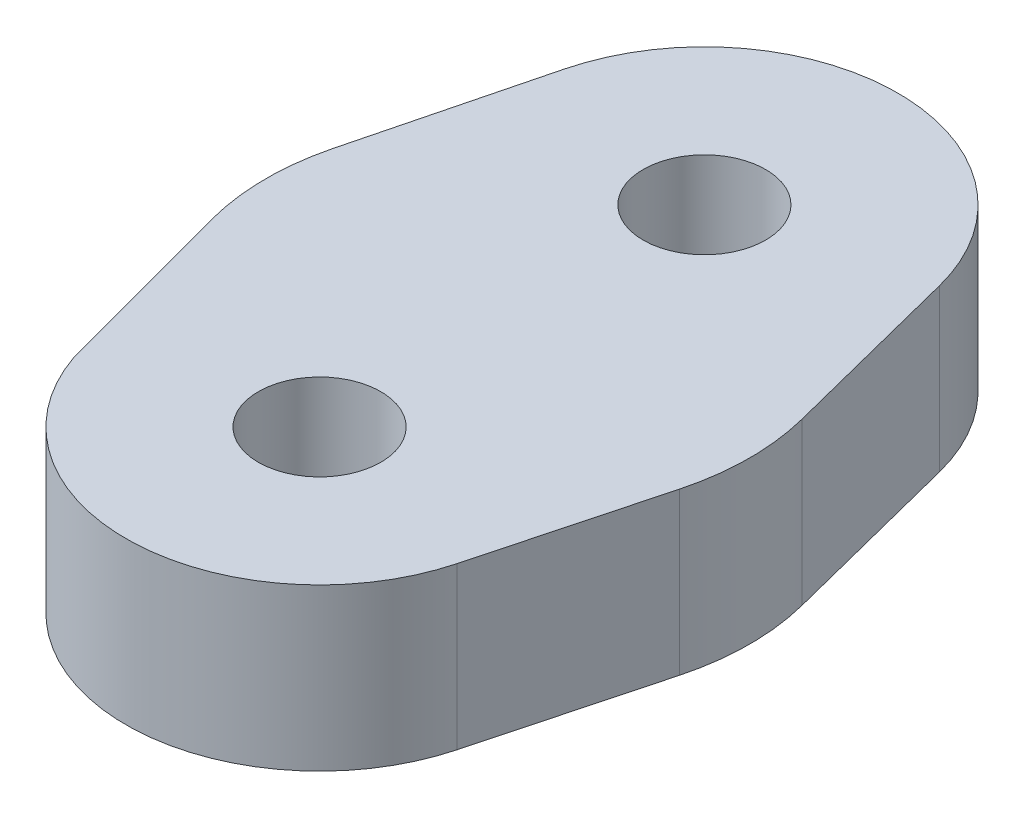
ISO-10303-21;
HEADER;
FILE_DESCRIPTION(('STEP AP214'),'2;1');
FILE_NAME('part.step','',(''),(''),'','','');
FILE_SCHEMA(('AUTOMOTIVE_DESIGN { 1 0 10303 214 1 1 1 1 }'));
ENDSEC;
DATA;
#1=APPLICATION_CONTEXT('core data for automotive mechanical design processes');
#2=APPLICATION_PROTOCOL_DEFINITION('international standard','automotive_design',2000,#1);
#3=PRODUCT_CONTEXT('',#1,'mechanical');
#4=PRODUCT('Part','Part','',(#3));
#5=PRODUCT_RELATED_PRODUCT_CATEGORY('part','',(#4));
#6=PRODUCT_DEFINITION_FORMATION('','',#4);
#7=PRODUCT_DEFINITION_CONTEXT('part definition',#1,'design');
#8=PRODUCT_DEFINITION('design','',#6,#7);
#9=PRODUCT_DEFINITION_SHAPE('','',#8);
#10=(LENGTH_UNIT() NAMED_UNIT(*) SI_UNIT(.MILLI.,.METRE.));
#11=(NAMED_UNIT(*) PLANE_ANGLE_UNIT() SI_UNIT($,.RADIAN.));
#12=(NAMED_UNIT(*) SI_UNIT($,.STERADIAN.) SOLID_ANGLE_UNIT());
#13=UNCERTAINTY_MEASURE_WITH_UNIT(LENGTH_MEASURE(1.E-05),#10,'distance_accuracy_value','');
#14=(GEOMETRIC_REPRESENTATION_CONTEXT(3) GLOBAL_UNCERTAINTY_ASSIGNED_CONTEXT((#13)) GLOBAL_UNIT_ASSIGNED_CONTEXT((#10,
#11,#12)) REPRESENTATION_CONTEXT('',''));
#15=CARTESIAN_POINT('',(0.,0.,0.));
#16=DIRECTION('',(0.,0.,1.));
#17=DIRECTION('',(1.,0.,0.));
#18=AXIS2_PLACEMENT_3D('',#15,#16,#17);
#19=CARTESIAN_POINT('',(10.7914021707681,5.,-2.7425994459952));
#20=DIRECTION('',(-0.969189489495146,0.,0.246316328025849));
#21=DIRECTION('',(0.246316328025849,0.,0.969189489495146));
#22=AXIS2_PLACEMENT_3D('',#19,#20,#21);
#23=PLANE('',#22);
#24=DIRECTION('',(-0.246316328025849,0.,-0.969189489495146));
#25=VECTOR('',#24,1.);
#26=CARTESIAN_POINT('',(10.7914021707681,0.,-2.7425994459952));
#27=LINE('',#26,#25);
#28=CARTESIAN_POINT('',(11.0189211712136,0.,-1.84737246019386));
#29=VERTEX_POINT('',#28);
#30=CARTESIAN_POINT('',(9.56513693697088,0.,-7.56762824313138));
#31=VERTEX_POINT('',#30);
#32=EDGE_CURVE('E129',#29,#31,#27,.T.);
#33=ORIENTED_EDGE('',*,*,#32,.T.);
#34=DIRECTION('',(0.,-1.,0.));
#35=VECTOR('',#34,1.);
#36=CARTESIAN_POINT('',(9.56513693697088,5.,-7.56762824313138));
#37=LINE('',#36,#35);
#38=CARTESIAN_POINT('',(9.56513693697088,5.,-7.56762824313138));
#39=VERTEX_POINT('',#38);
#40=EDGE_CURVE('E11',#39,#31,#37,.T.);
#41=ORIENTED_EDGE('',*,*,#40,.F.);
#42=DIRECTION('',(-0.246316328025849,0.,-0.969189489495146));
#43=VECTOR('',#42,1.);
#44=CARTESIAN_POINT('',(10.7914021707681,5.,-2.7425994459952));
#45=LINE('',#44,#43);
#46=CARTESIAN_POINT('',(11.0189211712136,5.,-1.84737246019386));
#47=VERTEX_POINT('',#46);
#48=EDGE_CURVE('E145',#47,#39,#45,.T.);
#49=ORIENTED_EDGE('',*,*,#48,.F.);
#50=DIRECTION('',(0.,-1.,0.));
#51=VECTOR('',#50,1.);
#52=CARTESIAN_POINT('',(11.0189211712136,5.,-1.84737246019386));
#53=LINE('',#52,#51);
#54=EDGE_CURVE('E125',#47,#29,#53,.T.);
#55=ORIENTED_EDGE('',*,*,#54,.T.);
#56=EDGE_LOOP('',(#33,#41,#49,#55));
#57=FACE_BOUND('',#56,.T.);
#58=ADVANCED_FACE('F34',(#57),#23,.F.);
#59=CARTESIAN_POINT('',(3.75,5.,-6.08973027497629));
#60=DIRECTION('',(0.,-1.,0.));
#61=DIRECTION('',(0.,0.,-1.));
#62=AXIS2_PLACEMENT_3D('',#59,#60,#61);
#63=CYLINDRICAL_SURFACE('',#62,6.);
#64=CARTESIAN_POINT('',(3.75,0.,-6.08973027497629));
#65=DIRECTION('',(0.,1.,0.));
#66=DIRECTION('',(0.,0.,1.));
#67=AXIS2_PLACEMENT_3D('',#64,#65,#66);
#68=CIRCLE('',#67,6.);
#69=CARTESIAN_POINT('',(-2.06513693697088,0.,-7.56762824313138));
#70=VERTEX_POINT('',#69);
#71=EDGE_CURVE('E132',#31,#70,#68,.T.);
#72=ORIENTED_EDGE('',*,*,#71,.T.);
#73=DIRECTION('',(0.,-1.,0.));
#74=VECTOR('',#73,1.);
#75=CARTESIAN_POINT('',(-2.06513693697088,5.,-7.56762824313138));
#76=LINE('',#75,#74);
#77=CARTESIAN_POINT('',(-2.06513693697088,5.,-7.56762824313138));
#78=VERTEX_POINT('',#77);
#79=EDGE_CURVE('E42',#78,#70,#76,.T.);
#80=ORIENTED_EDGE('',*,*,#79,.F.);
#81=CARTESIAN_POINT('',(3.75,5.,-6.08973027497629));
#82=DIRECTION('',(0.,1.,0.));
#83=DIRECTION('',(0.,0.,1.));
#84=AXIS2_PLACEMENT_3D('',#81,#82,#83);
#85=CIRCLE('',#84,6.);
#86=EDGE_CURVE('E89',#39,#78,#85,.T.);
#87=ORIENTED_EDGE('',*,*,#86,.F.);
#88=ORIENTED_EDGE('',*,*,#40,.T.);
#89=EDGE_LOOP('',(#72,#80,#87,#88));
#90=FACE_BOUND('',#89,.T.);
#91=ADVANCED_FACE('F212',(#90),#63,.T.);
#92=CARTESIAN_POINT('',(-3.74644017165911,5.,-0.95214547439252));
#93=DIRECTION('',(0.969189489495147,0.,0.246316328025848));
#94=DIRECTION('',(0.246316328025848,0.,-0.969189489495147));
#95=AXIS2_PLACEMENT_3D('',#92,#93,#94);
#96=PLANE('',#95);
#97=DIRECTION('',(-0.246316328025848,0.,0.969189489495147));
#98=VECTOR('',#97,1.);
#99=CARTESIAN_POINT('',(-3.74644017165911,0.,-0.95214547439252));
#100=LINE('',#99,#98);
#101=CARTESIAN_POINT('',(-3.5189211712136,0.,-1.84737246019386));
#102=VERTEX_POINT('',#101);
#103=EDGE_CURVE('E135',#70,#102,#100,.T.);
#104=ORIENTED_EDGE('',*,*,#103,.T.);
#105=DIRECTION('',(0.,-1.,0.));
#106=VECTOR('',#105,1.);
#107=CARTESIAN_POINT('',(-3.5189211712136,5.,-1.84737246019386));
#108=LINE('',#107,#106);
#109=CARTESIAN_POINT('',(-3.5189211712136,5.,-1.84737246019386));
#110=VERTEX_POINT('',#109);
#111=EDGE_CURVE('E152',#110,#102,#108,.T.);
#112=ORIENTED_EDGE('',*,*,#111,.F.);
#113=DIRECTION('',(-0.246316328025848,0.,0.969189489495147));
#114=VECTOR('',#113,1.);
#115=CARTESIAN_POINT('',(-3.74644017165911,5.,-0.95214547439252));
#116=LINE('',#115,#114);
#117=EDGE_CURVE('E160',#78,#110,#116,.T.);
#118=ORIENTED_EDGE('',*,*,#117,.F.);
#119=ORIENTED_EDGE('',*,*,#79,.T.);
#120=EDGE_LOOP('',(#104,#112,#118,#119));
#121=FACE_BOUND('',#120,.T.);
#122=ADVANCED_FACE('F158',(#121),#96,.F.);
#123=CARTESIAN_POINT('',(3.75,5.,0.));
#124=DIRECTION('',(0.,-1.,0.));
#125=DIRECTION('',(0.,0.,-1.));
#126=AXIS2_PLACEMENT_3D('',#123,#124,#125);
#127=CYLINDRICAL_SURFACE('',#126,7.5);
#128=CARTESIAN_POINT('',(3.75,0.,0.));
#129=DIRECTION('',(0.,1.,0.));
#130=DIRECTION('',(0.,0.,1.));
#131=AXIS2_PLACEMENT_3D('',#128,#129,#130);
#132=CIRCLE('',#131,7.5);
#133=CARTESIAN_POINT('',(-3.49342660554137,0.,1.94493470587972));
#134=VERTEX_POINT('',#133);
#135=EDGE_CURVE('E137',#102,#134,#132,.T.);
#136=ORIENTED_EDGE('',*,*,#135,.T.);
#137=DIRECTION('',(0.,-1.,0.));
#138=VECTOR('',#137,1.);
#139=CARTESIAN_POINT('',(-3.49342660554137,5.,1.94493470587972));
#140=LINE('',#139,#138);
#141=CARTESIAN_POINT('',(-3.49342660554137,5.,1.94493470587972));
#142=VERTEX_POINT('',#141);
#143=EDGE_CURVE('E149',#142,#134,#140,.T.);
#144=ORIENTED_EDGE('',*,*,#143,.F.);
#145=CARTESIAN_POINT('',(3.75,5.,0.));
#146=DIRECTION('',(0.,1.,0.));
#147=DIRECTION('',(0.,0.,1.));
#148=AXIS2_PLACEMENT_3D('',#145,#146,#147);
#149=CIRCLE('',#148,7.5);
#150=EDGE_CURVE('E172',#110,#142,#149,.T.);
#151=ORIENTED_EDGE('',*,*,#150,.F.);
#152=ORIENTED_EDGE('',*,*,#111,.T.);
#153=EDGE_LOOP('',(#136,#144,#151,#152));
#154=FACE_BOUND('',#153,.T.);
#155=ADVANCED_FACE('F168',(#154),#127,.T.);
#156=CARTESIAN_POINT('',(-3.7456113395504,5.,1.00573525290572));
#157=DIRECTION('',(0.965790214072183,0.,-0.259324627450629));
#158=DIRECTION('',(-0.259324627450629,0.,-0.965790214072183));
#159=AXIS2_PLACEMENT_3D('',#156,#157,#158);
#160=PLANE('',#159);
#161=DIRECTION('',(0.259324627450629,0.,0.965790214072183));
#162=VECTOR('',#161,1.);
#163=CARTESIAN_POINT('',(-3.7456113395504,0.,1.00573525290572));
#164=LINE('',#163,#162);
#165=CARTESIAN_POINT('',(-1.92167348288411,0.,7.79853912333431));
#166=VERTEX_POINT('',#165);
#167=EDGE_CURVE('E139',#134,#166,#164,.T.);
#168=ORIENTED_EDGE('',*,*,#167,.T.);
#169=DIRECTION('',(0.,-1.,0.));
#170=VECTOR('',#169,1.);
#171=CARTESIAN_POINT('',(-1.92167348288411,5.,7.79853912333431));
#172=LINE('',#171,#170);
#173=CARTESIAN_POINT('',(-1.92167348288411,5.,7.79853912333431));
#174=VERTEX_POINT('',#173);
#175=EDGE_CURVE('E121',#174,#166,#172,.T.);
#176=ORIENTED_EDGE('',*,*,#175,.F.);
#177=DIRECTION('',(0.259324627450629,0.,0.965790214072183));
#178=VECTOR('',#177,1.);
#179=CARTESIAN_POINT('',(-3.7456113395504,5.,1.00573525290572));
#180=LINE('',#179,#178);
#181=EDGE_CURVE('E108',#142,#174,#180,.T.);
#182=ORIENTED_EDGE('',*,*,#181,.F.);
#183=ORIENTED_EDGE('',*,*,#143,.T.);
#184=EDGE_LOOP('',(#168,#176,#182,#183));
#185=FACE_BOUND('',#184,.T.);
#186=ADVANCED_FACE('F171',(#185),#160,.F.);
#187=CARTESIAN_POINT('',(3.75,5.,5.84095900912463));
#188=DIRECTION('',(0.,-1.,0.));
#189=DIRECTION('',(0.,0.,-1.));
#190=AXIS2_PLACEMENT_3D('',#187,#188,#189);
#191=CYLINDRICAL_SURFACE('',#190,6.);
#192=CARTESIAN_POINT('',(3.75,0.,5.84095900912463));
#193=DIRECTION('',(0.,1.,0.));
#194=DIRECTION('',(0.,0.,1.));
#195=AXIS2_PLACEMENT_3D('',#192,#193,#194);
#196=CIRCLE('',#195,6.);
#197=CARTESIAN_POINT('',(9.54877601505246,0.,7.38180187173338));
#198=VERTEX_POINT('',#197);
#199=EDGE_CURVE('E117',#166,#198,#196,.T.);
#200=ORIENTED_EDGE('',*,*,#199,.T.);
#201=DIRECTION('',(0.,-1.,0.));
#202=VECTOR('',#201,1.);
#203=CARTESIAN_POINT('',(9.54877601505246,5.,7.38180187173338));
#204=LINE('',#203,#202);
#205=CARTESIAN_POINT('',(9.54877601505246,5.,7.38180187173338));
#206=VERTEX_POINT('',#205);
#207=EDGE_CURVE('E114',#206,#198,#204,.T.);
#208=ORIENTED_EDGE('',*,*,#207,.F.);
#209=CARTESIAN_POINT('',(3.75,5.,5.84095900912463));
#210=DIRECTION('',(0.,1.,0.));
#211=DIRECTION('',(0.,0.,1.));
#212=AXIS2_PLACEMENT_3D('',#209,#210,#211);
#213=CIRCLE('',#212,6.);
#214=EDGE_CURVE('E102',#174,#206,#213,.T.);
#215=ORIENTED_EDGE('',*,*,#214,.F.);
#216=ORIENTED_EDGE('',*,*,#175,.T.);
#217=EDGE_LOOP('',(#200,#208,#215,#216));
#218=FACE_BOUND('',#217,.T.);
#219=ADVANCED_FACE('F115',(#218),#191,.T.);
#220=CARTESIAN_POINT('',(10.7511578597268,5.,2.8567830193714));
#221=DIRECTION('',(0.96646266917541,0.,0.256807143768126));
#222=DIRECTION('',(0.256807143768126,0.,-0.96646266917541));
#223=AXIS2_PLACEMENT_3D('',#220,#221,#222);
#224=PLANE('',#223);
#225=DIRECTION('',(-0.256807143768126,0.,0.96646266917541));
#226=VECTOR('',#225,1.);
#227=CARTESIAN_POINT('',(10.7511578597268,0.,2.8567830193714));
#228=LINE('',#227,#226);
#229=CARTESIAN_POINT('',(10.9984700188156,0.,1.92605357826094));
#230=VERTEX_POINT('',#229);
#231=EDGE_CURVE('E142',#230,#198,#228,.T.);
#232=ORIENTED_EDGE('',*,*,#231,.F.);
#233=DIRECTION('',(0.,-1.,0.));
#234=VECTOR('',#233,1.);
#235=CARTESIAN_POINT('',(10.9984700188156,5.,1.92605357826094));
#236=LINE('',#235,#234);
#237=CARTESIAN_POINT('',(10.9984700188156,5.,1.92605357826094));
#238=VERTEX_POINT('',#237);
#239=EDGE_CURVE('E78',#238,#230,#236,.T.);
#240=ORIENTED_EDGE('',*,*,#239,.F.);
#241=DIRECTION('',(-0.256807143768126,0.,0.96646266917541));
#242=VECTOR('',#241,1.);
#243=CARTESIAN_POINT('',(10.7511578597268,5.,2.8567830193714));
#244=LINE('',#243,#242);
#245=EDGE_CURVE('E106',#238,#206,#244,.T.);
#246=ORIENTED_EDGE('',*,*,#245,.T.);
#247=ORIENTED_EDGE('',*,*,#207,.T.);
#248=EDGE_LOOP('',(#232,#240,#246,#247));
#249=FACE_BOUND('',#248,.T.);
#250=ADVANCED_FACE('F123',(#249),#224,.T.);
#251=CARTESIAN_POINT('',(3.75,5.,0.));
#252=DIRECTION('',(0.,-1.,0.));
#253=DIRECTION('',(0.,0.,-1.));
#254=AXIS2_PLACEMENT_3D('',#251,#252,#253);
#255=CYLINDRICAL_SURFACE('',#254,7.5);
#256=CARTESIAN_POINT('',(3.75,0.,0.));
#257=DIRECTION('',(0.,1.,0.));
#258=DIRECTION('',(0.,0.,1.));
#259=AXIS2_PLACEMENT_3D('',#256,#257,#258);
#260=CIRCLE('',#259,7.5);
#261=EDGE_CURVE('E81',#230,#29,#260,.T.);
#262=ORIENTED_EDGE('',*,*,#261,.T.);
#263=ORIENTED_EDGE('',*,*,#54,.F.);
#264=CARTESIAN_POINT('',(3.75,5.,0.));
#265=DIRECTION('',(0.,1.,0.));
#266=DIRECTION('',(0.,0.,1.));
#267=AXIS2_PLACEMENT_3D('',#264,#265,#266);
#268=CIRCLE('',#267,7.5);
#269=EDGE_CURVE('E50',#238,#47,#268,.T.);
#270=ORIENTED_EDGE('',*,*,#269,.F.);
#271=ORIENTED_EDGE('',*,*,#239,.T.);
#272=EDGE_LOOP('',(#262,#263,#270,#271));
#273=FACE_BOUND('',#272,.T.);
#274=ADVANCED_FACE('F194',(#273),#255,.T.);
#275=CARTESIAN_POINT('',(0.,5.,0.));
#276=DIRECTION('',(0.,1.,0.));
#277=DIRECTION('',(0.,0.,1.));
#278=AXIS2_PLACEMENT_3D('',#275,#276,#277);
#279=PLANE('',#278);
#280=CARTESIAN_POINT('',(3.75,5.,-6.08973027497629));
#281=DIRECTION('',(0.,1.,0.));
#282=DIRECTION('',(0.,0.,1.));
#283=AXIS2_PLACEMENT_3D('',#280,#281,#282);
#284=CIRCLE('',#283,1.89864999999999);
#285=CARTESIAN_POINT('',(3.75,5.,-4.1910802749763));
#286=VERTEX_POINT('',#285);
#287=EDGE_CURVE('E186',#286,#286,#284,.T.);
#288=ORIENTED_EDGE('',*,*,#287,.F.);
#289=EDGE_LOOP('',(#288));
#290=FACE_BOUND('',#289,.T.);
#291=CARTESIAN_POINT('',(3.75,5.,5.84095900912463));
#292=DIRECTION('',(0.,1.,0.));
#293=DIRECTION('',(0.,0.,1.));
#294=AXIS2_PLACEMENT_3D('',#291,#292,#293);
#295=CIRCLE('',#294,1.89864999999999);
#296=CARTESIAN_POINT('',(3.75,5.,7.73960900912462));
#297=VERTEX_POINT('',#296);
#298=EDGE_CURVE('E180',#297,#297,#295,.T.);
#299=ORIENTED_EDGE('',*,*,#298,.F.);
#300=EDGE_LOOP('',(#299));
#301=FACE_BOUND('',#300,.T.);
#302=ORIENTED_EDGE('',*,*,#48,.T.);
#303=ORIENTED_EDGE('',*,*,#86,.T.);
#304=ORIENTED_EDGE('',*,*,#117,.T.);
#305=ORIENTED_EDGE('',*,*,#150,.T.);
#306=ORIENTED_EDGE('',*,*,#181,.T.);
#307=ORIENTED_EDGE('',*,*,#214,.T.);
#308=ORIENTED_EDGE('',*,*,#245,.F.);
#309=ORIENTED_EDGE('',*,*,#269,.T.);
#310=EDGE_LOOP('',(#302,#303,#304,#305,#306,#307,#308,#309));
#311=FACE_BOUND('',#310,.T.);
#312=ADVANCED_FACE('F104',(#290,#301,#311),#279,.T.);
#313=CARTESIAN_POINT('',(0.,0.,0.));
#314=DIRECTION('',(0.,1.,0.));
#315=DIRECTION('',(0.,0.,1.));
#316=AXIS2_PLACEMENT_3D('',#313,#314,#315);
#317=PLANE('',#316);
#318=CARTESIAN_POINT('',(3.75,0.,-6.08973027497629));
#319=DIRECTION('',(0.,1.,0.));
#320=DIRECTION('',(0.,0.,1.));
#321=AXIS2_PLACEMENT_3D('',#318,#319,#320);
#322=CIRCLE('',#321,1.89865);
#323=CARTESIAN_POINT('',(3.75,0.,-4.19108027497629));
#324=VERTEX_POINT('',#323);
#325=EDGE_CURVE('E183',#324,#324,#322,.T.);
#326=ORIENTED_EDGE('',*,*,#325,.T.);
#327=EDGE_LOOP('',(#326));
#328=FACE_BOUND('',#327,.T.);
#329=CARTESIAN_POINT('',(3.75,0.,5.84095900912463));
#330=DIRECTION('',(0.,1.,0.));
#331=DIRECTION('',(0.,0.,1.));
#332=AXIS2_PLACEMENT_3D('',#329,#330,#331);
#333=CIRCLE('',#332,1.89865);
#334=CARTESIAN_POINT('',(3.75,0.,7.73960900912463));
#335=VERTEX_POINT('',#334);
#336=EDGE_CURVE('E133',#335,#335,#333,.T.);
#337=ORIENTED_EDGE('',*,*,#336,.T.);
#338=EDGE_LOOP('',(#337));
#339=FACE_BOUND('',#338,.T.);
#340=ORIENTED_EDGE('',*,*,#32,.F.);
#341=ORIENTED_EDGE('',*,*,#261,.F.);
#342=ORIENTED_EDGE('',*,*,#231,.T.);
#343=ORIENTED_EDGE('',*,*,#199,.F.);
#344=ORIENTED_EDGE('',*,*,#167,.F.);
#345=ORIENTED_EDGE('',*,*,#135,.F.);
#346=ORIENTED_EDGE('',*,*,#103,.F.);
#347=ORIENTED_EDGE('',*,*,#71,.F.);
#348=EDGE_LOOP('',(#340,#341,#342,#343,#344,#345,#346,#347));
#349=FACE_BOUND('',#348,.T.);
#350=ADVANCED_FACE('F164',(#328,#339,#349),#317,.F.);
#351=CARTESIAN_POINT('',(3.75,5.,5.84095900912463));
#352=DIRECTION('',(0.,1.,0.));
#353=DIRECTION('',(0.,0.,1.));
#354=AXIS2_PLACEMENT_3D('',#351,#352,#353);
#355=CYLINDRICAL_SURFACE('',#354,1.89864999999999);
#356=ORIENTED_EDGE('',*,*,#336,.F.);
#357=EDGE_LOOP('',(#356));
#358=FACE_BOUND('',#357,.T.);
#359=ORIENTED_EDGE('',*,*,#298,.T.);
#360=EDGE_LOOP('',(#359));
#361=FACE_BOUND('',#360,.T.);
#362=ADVANCED_FACE('F198',(#358,#361),#355,.F.);
#363=CARTESIAN_POINT('',(3.75,5.,-6.08973027497629));
#364=DIRECTION('',(0.,1.,0.));
#365=DIRECTION('',(0.,0.,1.));
#366=AXIS2_PLACEMENT_3D('',#363,#364,#365);
#367=CYLINDRICAL_SURFACE('',#366,1.89864999999999);
#368=ORIENTED_EDGE('',*,*,#325,.F.);
#369=EDGE_LOOP('',(#368));
#370=FACE_BOUND('',#369,.T.);
#371=ORIENTED_EDGE('',*,*,#287,.T.);
#372=EDGE_LOOP('',(#371));
#373=FACE_BOUND('',#372,.T.);
#374=ADVANCED_FACE('F190',(#370,#373),#367,.F.);
#375=CLOSED_SHELL('',(#58,#91,#122,#155,#186,#219,#250,#274,#312,#350,#362,#374));
#376=MANIFOLD_SOLID_BREP('B2',#375);
#377=ADVANCED_BREP_SHAPE_REPRESENTATION('',(#18,#376),#14);
#378=SHAPE_DEFINITION_REPRESENTATION(#9,#377);
ENDSEC;
END-ISO-10303-21;
